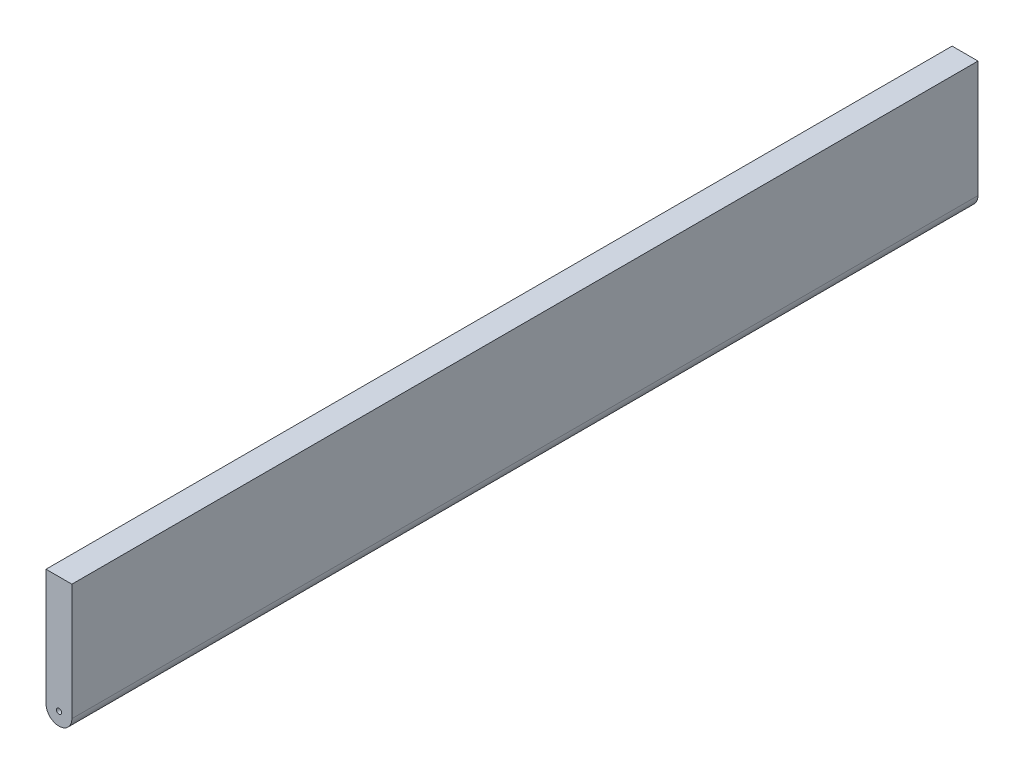
ISO-10303-21;
HEADER;
FILE_DESCRIPTION(('STEP AP214'),'2;1');
FILE_NAME('part.step','',(''),(''),'','','');
FILE_SCHEMA(('AUTOMOTIVE_DESIGN { 1 0 10303 214 1 1 1 1 }'));
ENDSEC;
DATA;
#1=APPLICATION_CONTEXT('core data for automotive mechanical design processes');
#2=APPLICATION_PROTOCOL_DEFINITION('international standard','automotive_design',2000,#1);
#3=PRODUCT_CONTEXT('',#1,'mechanical');
#4=PRODUCT('Part','Part','',(#3));
#5=PRODUCT_RELATED_PRODUCT_CATEGORY('part','',(#4));
#6=PRODUCT_DEFINITION_FORMATION('','',#4);
#7=PRODUCT_DEFINITION_CONTEXT('part definition',#1,'design');
#8=PRODUCT_DEFINITION('design','',#6,#7);
#9=PRODUCT_DEFINITION_SHAPE('','',#8);
#10=(LENGTH_UNIT() NAMED_UNIT(*) SI_UNIT(.MILLI.,.METRE.));
#11=(NAMED_UNIT(*) PLANE_ANGLE_UNIT() SI_UNIT($,.RADIAN.));
#12=(NAMED_UNIT(*) SI_UNIT($,.STERADIAN.) SOLID_ANGLE_UNIT());
#13=UNCERTAINTY_MEASURE_WITH_UNIT(LENGTH_MEASURE(1.E-05),#10,'distance_accuracy_value','');
#14=(GEOMETRIC_REPRESENTATION_CONTEXT(3) GLOBAL_UNCERTAINTY_ASSIGNED_CONTEXT((#13)) GLOBAL_UNIT_ASSIGNED_CONTEXT((#10,
#11,#12)) REPRESENTATION_CONTEXT('',''));
#15=CARTESIAN_POINT('',(0.,0.,0.));
#16=DIRECTION('',(0.,0.,1.));
#17=DIRECTION('',(1.,0.,0.));
#18=AXIS2_PLACEMENT_3D('',#15,#16,#17);
#19=CARTESIAN_POINT('',(1.27,0.,88.9));
#20=DIRECTION('',(0.,0.,-1.));
#21=DIRECTION('',(-1.,0.,0.));
#22=AXIS2_PLACEMENT_3D('',#19,#20,#21);
#23=CYLINDRICAL_SURFACE('',#22,1.27);
#24=CARTESIAN_POINT('',(1.27,0.,0.));
#25=DIRECTION('',(0.,0.,1.));
#26=DIRECTION('',(-1.,0.,0.));
#27=AXIS2_PLACEMENT_3D('',#24,#25,#26);
#28=CIRCLE('',#27,1.27);
#29=CARTESIAN_POINT('',(0.,0.,0.));
#30=VERTEX_POINT('',#29);
#31=CARTESIAN_POINT('',(2.54,0.,0.));
#32=VERTEX_POINT('',#31);
#33=EDGE_CURVE('E107',#30,#32,#28,.T.);
#34=ORIENTED_EDGE('',*,*,#33,.T.);
#35=DIRECTION('',(0.,0.,-1.));
#36=VECTOR('',#35,1.);
#37=CARTESIAN_POINT('',(2.54,0.,88.9));
#38=LINE('',#37,#36);
#39=CARTESIAN_POINT('',(2.54,0.,88.9));
#40=VERTEX_POINT('',#39);
#41=EDGE_CURVE('E11',#40,#32,#38,.T.);
#42=ORIENTED_EDGE('',*,*,#41,.F.);
#43=CARTESIAN_POINT('',(1.27,0.,88.9));
#44=DIRECTION('',(0.,0.,1.));
#45=DIRECTION('',(-1.,0.,0.));
#46=AXIS2_PLACEMENT_3D('',#43,#44,#45);
#47=CIRCLE('',#46,1.27);
#48=CARTESIAN_POINT('',(0.,0.,88.9));
#49=VERTEX_POINT('',#48);
#50=EDGE_CURVE('E91',#49,#40,#47,.T.);
#51=ORIENTED_EDGE('',*,*,#50,.F.);
#52=DIRECTION('',(0.,0.,-1.));
#53=VECTOR('',#52,1.);
#54=CARTESIAN_POINT('',(0.,0.,88.9));
#55=LINE('',#54,#53);
#56=EDGE_CURVE('E103',#49,#30,#55,.T.);
#57=ORIENTED_EDGE('',*,*,#56,.T.);
#58=EDGE_LOOP('',(#34,#42,#51,#57));
#59=FACE_BOUND('',#58,.T.);
#60=ADVANCED_FACE('F39',(#59),#23,.T.);
#61=CARTESIAN_POINT('',(2.54,0.,88.9));
#62=DIRECTION('',(-1.,0.,0.));
#63=DIRECTION('',(0.,-1.,0.));
#64=AXIS2_PLACEMENT_3D('',#61,#62,#63);
#65=PLANE('',#64);
#66=DIRECTION('',(0.,1.,0.));
#67=VECTOR('',#66,1.);
#68=CARTESIAN_POINT('',(2.54,0.,0.));
#69=LINE('',#68,#67);
#70=CARTESIAN_POINT('',(2.54,11.43,0.));
#71=VERTEX_POINT('',#70);
#72=EDGE_CURVE('E96',#32,#71,#69,.T.);
#73=ORIENTED_EDGE('',*,*,#72,.T.);
#74=DIRECTION('',(0.,0.,-1.));
#75=VECTOR('',#74,1.);
#76=CARTESIAN_POINT('',(2.54,11.43,88.9));
#77=LINE('',#76,#75);
#78=CARTESIAN_POINT('',(2.54,11.43,88.9));
#79=VERTEX_POINT('',#78);
#80=EDGE_CURVE('E48',#79,#71,#77,.T.);
#81=ORIENTED_EDGE('',*,*,#80,.F.);
#82=DIRECTION('',(0.,1.,0.));
#83=VECTOR('',#82,1.);
#84=CARTESIAN_POINT('',(2.54,0.,88.9));
#85=LINE('',#84,#83);
#86=EDGE_CURVE('E86',#40,#79,#85,.T.);
#87=ORIENTED_EDGE('',*,*,#86,.F.);
#88=ORIENTED_EDGE('',*,*,#41,.T.);
#89=EDGE_LOOP('',(#73,#81,#87,#88));
#90=FACE_BOUND('',#89,.T.);
#91=ADVANCED_FACE('F95',(#90),#65,.F.);
#92=CARTESIAN_POINT('',(0.,11.43,88.9));
#93=DIRECTION('',(0.,-1.,0.));
#94=DIRECTION('',(0.,0.,-1.));
#95=AXIS2_PLACEMENT_3D('',#92,#93,#94);
#96=PLANE('',#95);
#97=DIRECTION('',(-1.,0.,0.));
#98=VECTOR('',#97,1.);
#99=CARTESIAN_POINT('',(0.,11.43,0.));
#100=LINE('',#99,#98);
#101=CARTESIAN_POINT('',(0.,11.43,0.));
#102=VERTEX_POINT('',#101);
#103=EDGE_CURVE('E73',#71,#102,#100,.T.);
#104=ORIENTED_EDGE('',*,*,#103,.T.);
#105=DIRECTION('',(0.,0.,-1.));
#106=VECTOR('',#105,1.);
#107=CARTESIAN_POINT('',(0.,11.43,88.9));
#108=LINE('',#107,#106);
#109=CARTESIAN_POINT('',(0.,11.43,88.9));
#110=VERTEX_POINT('',#109);
#111=EDGE_CURVE('E98',#110,#102,#108,.T.);
#112=ORIENTED_EDGE('',*,*,#111,.F.);
#113=DIRECTION('',(-1.,0.,0.));
#114=VECTOR('',#113,1.);
#115=CARTESIAN_POINT('',(0.,11.43,88.9));
#116=LINE('',#115,#114);
#117=EDGE_CURVE('E89',#79,#110,#116,.T.);
#118=ORIENTED_EDGE('',*,*,#117,.F.);
#119=ORIENTED_EDGE('',*,*,#80,.T.);
#120=EDGE_LOOP('',(#104,#112,#118,#119));
#121=FACE_BOUND('',#120,.T.);
#122=ADVANCED_FACE('F99',(#121),#96,.F.);
#123=CARTESIAN_POINT('',(0.,0.,88.9));
#124=DIRECTION('',(1.,0.,0.));
#125=DIRECTION('',(0.,1.,0.));
#126=AXIS2_PLACEMENT_3D('',#123,#124,#125);
#127=PLANE('',#126);
#128=DIRECTION('',(0.,-1.,0.));
#129=VECTOR('',#128,1.);
#130=CARTESIAN_POINT('',(0.,0.,0.));
#131=LINE('',#130,#129);
#132=EDGE_CURVE('E79',#102,#30,#131,.T.);
#133=ORIENTED_EDGE('',*,*,#132,.T.);
#134=ORIENTED_EDGE('',*,*,#56,.F.);
#135=DIRECTION('',(0.,-1.,0.));
#136=VECTOR('',#135,1.);
#137=CARTESIAN_POINT('',(0.,0.,88.9));
#138=LINE('',#137,#136);
#139=EDGE_CURVE('E56',#110,#49,#138,.T.);
#140=ORIENTED_EDGE('',*,*,#139,.F.);
#141=ORIENTED_EDGE('',*,*,#111,.T.);
#142=EDGE_LOOP('',(#133,#134,#140,#141));
#143=FACE_BOUND('',#142,.T.);
#144=ADVANCED_FACE('F121',(#143),#127,.F.);
#145=CARTESIAN_POINT('',(1.27,0.,88.9));
#146=DIRECTION('',(0.,0.,-1.));
#147=DIRECTION('',(-1.,0.,0.));
#148=AXIS2_PLACEMENT_3D('',#145,#146,#147);
#149=PLANE('',#148);
#150=CARTESIAN_POINT('',(1.27,0.,88.9));
#151=DIRECTION('',(0.,0.,1.));
#152=DIRECTION('',(1.,0.,0.));
#153=AXIS2_PLACEMENT_3D('',#150,#151,#152);
#154=CIRCLE('',#153,0.254);
#155=CARTESIAN_POINT('',(1.524,0.,88.9));
#156=VERTEX_POINT('',#155);
#157=EDGE_CURVE('E128',#156,#156,#154,.T.);
#158=ORIENTED_EDGE('',*,*,#157,.F.);
#159=EDGE_LOOP('',(#158));
#160=FACE_BOUND('',#159,.T.);
#161=ORIENTED_EDGE('',*,*,#50,.T.);
#162=ORIENTED_EDGE('',*,*,#86,.T.);
#163=ORIENTED_EDGE('',*,*,#117,.T.);
#164=ORIENTED_EDGE('',*,*,#139,.T.);
#165=EDGE_LOOP('',(#161,#162,#163,#164));
#166=FACE_BOUND('',#165,.T.);
#167=ADVANCED_FACE('F87',(#160,#166),#149,.F.);
#168=CARTESIAN_POINT('',(1.27,0.,0.));
#169=DIRECTION('',(0.,0.,-1.));
#170=DIRECTION('',(-1.,0.,0.));
#171=AXIS2_PLACEMENT_3D('',#168,#169,#170);
#172=PLANE('',#171);
#173=CARTESIAN_POINT('',(1.27,0.,0.));
#174=DIRECTION('',(0.,0.,1.));
#175=DIRECTION('',(1.,0.,0.));
#176=AXIS2_PLACEMENT_3D('',#173,#174,#175);
#177=CIRCLE('',#176,0.254);
#178=CARTESIAN_POINT('',(1.524,0.,0.));
#179=VERTEX_POINT('',#178);
#180=EDGE_CURVE('E111',#179,#179,#177,.T.);
#181=ORIENTED_EDGE('',*,*,#180,.T.);
#182=EDGE_LOOP('',(#181));
#183=FACE_BOUND('',#182,.T.);
#184=ORIENTED_EDGE('',*,*,#33,.F.);
#185=ORIENTED_EDGE('',*,*,#132,.F.);
#186=ORIENTED_EDGE('',*,*,#103,.F.);
#187=ORIENTED_EDGE('',*,*,#72,.F.);
#188=EDGE_LOOP('',(#184,#185,#186,#187));
#189=FACE_BOUND('',#188,.T.);
#190=ADVANCED_FACE('F124',(#183,#189),#172,.T.);
#191=CARTESIAN_POINT('',(1.27,0.,0.));
#192=DIRECTION('',(0.,0.,1.));
#193=DIRECTION('',(1.,0.,0.));
#194=AXIS2_PLACEMENT_3D('',#191,#192,#193);
#195=CYLINDRICAL_SURFACE('',#194,0.254);
#196=ORIENTED_EDGE('',*,*,#180,.F.);
#197=EDGE_LOOP('',(#196));
#198=FACE_BOUND('',#197,.T.);
#199=ORIENTED_EDGE('',*,*,#157,.T.);
#200=EDGE_LOOP('',(#199));
#201=FACE_BOUND('',#200,.T.);
#202=ADVANCED_FACE('F137',(#198,#201),#195,.F.);
#203=CLOSED_SHELL('',(#60,#91,#122,#144,#167,#190,#202));
#204=MANIFOLD_SOLID_BREP('B2',#203);
#205=ADVANCED_BREP_SHAPE_REPRESENTATION('',(#18,#204),#14);
#206=SHAPE_DEFINITION_REPRESENTATION(#9,#205);
ENDSEC;
END-ISO-10303-21;
